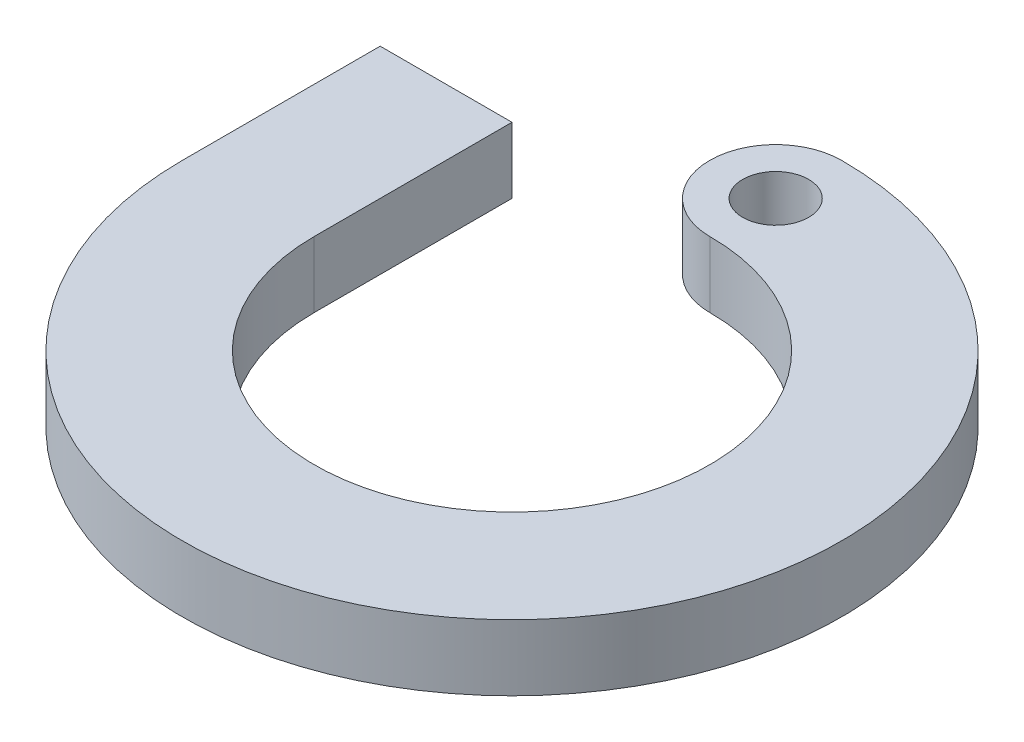
ISO-10303-21;
HEADER;
FILE_DESCRIPTION(('STEP AP214'),'2;1');
FILE_NAME('part.step','',(''),(''),'','','');
FILE_SCHEMA(('AUTOMOTIVE_DESIGN { 1 0 10303 214 1 1 1 1 }'));
ENDSEC;
DATA;
#1=APPLICATION_CONTEXT('core data for automotive mechanical design processes');
#2=APPLICATION_PROTOCOL_DEFINITION('international standard','automotive_design',2000,#1);
#3=PRODUCT_CONTEXT('',#1,'mechanical');
#4=PRODUCT('Part','Part','',(#3));
#5=PRODUCT_RELATED_PRODUCT_CATEGORY('part','',(#4));
#6=PRODUCT_DEFINITION_FORMATION('','',#4);
#7=PRODUCT_DEFINITION_CONTEXT('part definition',#1,'design');
#8=PRODUCT_DEFINITION('design','',#6,#7);
#9=PRODUCT_DEFINITION_SHAPE('','',#8);
#10=(LENGTH_UNIT() NAMED_UNIT(*) SI_UNIT(.MILLI.,.METRE.));
#11=(NAMED_UNIT(*) PLANE_ANGLE_UNIT() SI_UNIT($,.RADIAN.));
#12=(NAMED_UNIT(*) SI_UNIT($,.STERADIAN.) SOLID_ANGLE_UNIT());
#13=UNCERTAINTY_MEASURE_WITH_UNIT(LENGTH_MEASURE(1.E-05),#10,'distance_accuracy_value','');
#14=(GEOMETRIC_REPRESENTATION_CONTEXT(3) GLOBAL_UNCERTAINTY_ASSIGNED_CONTEXT((#13)) GLOBAL_UNIT_ASSIGNED_CONTEXT((#10,
#11,#12)) REPRESENTATION_CONTEXT('',''));
#15=CARTESIAN_POINT('',(0.,0.,0.));
#16=DIRECTION('',(0.,0.,1.));
#17=DIRECTION('',(1.,0.,0.));
#18=AXIS2_PLACEMENT_3D('',#15,#16,#17);
#19=CARTESIAN_POINT('',(0.,10.,0.));
#20=DIRECTION('',(0.,1.,0.));
#21=DIRECTION('',(0.,0.,1.));
#22=AXIS2_PLACEMENT_3D('',#19,#20,#21);
#23=PLANE('',#22);
#24=DIRECTION('',(0.,0.,-1.));
#25=VECTOR('',#24,1.);
#26=CARTESIAN_POINT('',(-30.,10.,0.));
#27=LINE('',#26,#25);
#28=CARTESIAN_POINT('',(-30.,10.,0.));
#29=VERTEX_POINT('',#28);
#30=CARTESIAN_POINT('',(-30.,10.,-30.));
#31=VERTEX_POINT('',#30);
#32=EDGE_CURVE('E152',#29,#31,#27,.T.);
#33=ORIENTED_EDGE('',*,*,#32,.T.);
#34=DIRECTION('',(-1.,0.,0.));
#35=VECTOR('',#34,1.);
#36=CARTESIAN_POINT('',(-50.,10.,-30.));
#37=LINE('',#36,#35);
#38=CARTESIAN_POINT('',(-50.,10.,-30.));
#39=VERTEX_POINT('',#38);
#40=EDGE_CURVE('E100',#31,#39,#37,.T.);
#41=ORIENTED_EDGE('',*,*,#40,.T.);
#42=DIRECTION('',(0.,0.,1.));
#43=VECTOR('',#42,1.);
#44=CARTESIAN_POINT('',(-50.,10.,0.));
#45=LINE('',#44,#43);
#46=CARTESIAN_POINT('',(-50.,10.,0.));
#47=VERTEX_POINT('',#46);
#48=EDGE_CURVE('E113',#39,#47,#45,.T.);
#49=ORIENTED_EDGE('',*,*,#48,.T.);
#50=CARTESIAN_POINT('',(0.,10.,0.));
#51=DIRECTION('',(0.,1.,0.));
#52=DIRECTION('',(0.,0.,1.));
#53=AXIS2_PLACEMENT_3D('',#50,#51,#52);
#54=CIRCLE('',#53,50.);
#55=CARTESIAN_POINT('',(0.,10.,-50.));
#56=VERTEX_POINT('',#55);
#57=EDGE_CURVE('E107',#47,#56,#54,.T.);
#58=ORIENTED_EDGE('',*,*,#57,.T.);
#59=CARTESIAN_POINT('',(0.,10.,-40.));
#60=DIRECTION('',(0.,1.,0.));
#61=DIRECTION('',(0.,0.,1.));
#62=AXIS2_PLACEMENT_3D('',#59,#60,#61);
#63=CIRCLE('',#62,10.);
#64=CARTESIAN_POINT('',(0.,10.,-30.));
#65=VERTEX_POINT('',#64);
#66=EDGE_CURVE('E111',#56,#65,#63,.T.);
#67=ORIENTED_EDGE('',*,*,#66,.T.);
#68=CARTESIAN_POINT('',(0.,10.,0.));
#69=DIRECTION('',(0.,-1.,0.));
#70=DIRECTION('',(0.,0.,1.));
#71=AXIS2_PLACEMENT_3D('',#68,#69,#70);
#72=CIRCLE('',#71,30.);
#73=EDGE_CURVE('E63',#65,#29,#72,.T.);
#74=ORIENTED_EDGE('',*,*,#73,.T.);
#75=EDGE_LOOP('',(#33,#41,#49,#58,#67,#74));
#76=FACE_BOUND('',#75,.T.);
#77=CARTESIAN_POINT('',(0.,10.,-40.));
#78=DIRECTION('',(0.,1.,0.));
#79=DIRECTION('',(0.,0.,1.));
#80=AXIS2_PLACEMENT_3D('',#77,#78,#79);
#81=CIRCLE('',#80,5.);
#82=CARTESIAN_POINT('',(0.,10.,-35.));
#83=VERTEX_POINT('',#82);
#84=EDGE_CURVE('E140',#83,#83,#81,.T.);
#85=ORIENTED_EDGE('',*,*,#84,.F.);
#86=EDGE_LOOP('',(#85));
#87=FACE_BOUND('',#86,.T.);
#88=ADVANCED_FACE('F45',(#76,#87),#23,.T.);
#89=CARTESIAN_POINT('',(0.,0.,0.));
#90=DIRECTION('',(0.,1.,0.));
#91=DIRECTION('',(0.,0.,1.));
#92=AXIS2_PLACEMENT_3D('',#89,#90,#91);
#93=PLANE('',#92);
#94=DIRECTION('',(0.,0.,-1.));
#95=VECTOR('',#94,1.);
#96=CARTESIAN_POINT('',(-30.,0.,0.));
#97=LINE('',#96,#95);
#98=CARTESIAN_POINT('',(-30.,0.,0.));
#99=VERTEX_POINT('',#98);
#100=CARTESIAN_POINT('',(-30.,0.,-30.));
#101=VERTEX_POINT('',#100);
#102=EDGE_CURVE('E135',#99,#101,#97,.T.);
#103=ORIENTED_EDGE('',*,*,#102,.F.);
#104=CARTESIAN_POINT('',(0.,0.,0.));
#105=DIRECTION('',(0.,-1.,0.));
#106=DIRECTION('',(0.,0.,1.));
#107=AXIS2_PLACEMENT_3D('',#104,#105,#106);
#108=CIRCLE('',#107,30.);
#109=CARTESIAN_POINT('',(0.,0.,-30.));
#110=VERTEX_POINT('',#109);
#111=EDGE_CURVE('E92',#110,#99,#108,.T.);
#112=ORIENTED_EDGE('',*,*,#111,.F.);
#113=CARTESIAN_POINT('',(0.,0.,-40.));
#114=DIRECTION('',(0.,1.,0.));
#115=DIRECTION('',(0.,0.,1.));
#116=AXIS2_PLACEMENT_3D('',#113,#114,#115);
#117=CIRCLE('',#116,10.);
#118=CARTESIAN_POINT('',(0.,0.,-50.));
#119=VERTEX_POINT('',#118);
#120=EDGE_CURVE('E86',#119,#110,#117,.T.);
#121=ORIENTED_EDGE('',*,*,#120,.F.);
#122=CARTESIAN_POINT('',(0.,0.,0.));
#123=DIRECTION('',(0.,1.,0.));
#124=DIRECTION('',(0.,0.,1.));
#125=AXIS2_PLACEMENT_3D('',#122,#123,#124);
#126=CIRCLE('',#125,50.);
#127=CARTESIAN_POINT('',(-50.,0.,0.));
#128=VERTEX_POINT('',#127);
#129=EDGE_CURVE('E122',#128,#119,#126,.T.);
#130=ORIENTED_EDGE('',*,*,#129,.F.);
#131=DIRECTION('',(0.,0.,1.));
#132=VECTOR('',#131,1.);
#133=CARTESIAN_POINT('',(-50.,0.,0.));
#134=LINE('',#133,#132);
#135=CARTESIAN_POINT('',(-50.,0.,-30.));
#136=VERTEX_POINT('',#135);
#137=EDGE_CURVE('E143',#136,#128,#134,.T.);
#138=ORIENTED_EDGE('',*,*,#137,.F.);
#139=DIRECTION('',(-1.,0.,0.));
#140=VECTOR('',#139,1.);
#141=CARTESIAN_POINT('',(-50.,0.,-30.));
#142=LINE('',#141,#140);
#143=EDGE_CURVE('E139',#101,#136,#142,.T.);
#144=ORIENTED_EDGE('',*,*,#143,.F.);
#145=EDGE_LOOP('',(#103,#112,#121,#130,#138,#144));
#146=FACE_BOUND('',#145,.T.);
#147=CARTESIAN_POINT('',(0.,0.,-40.));
#148=DIRECTION('',(0.,1.,0.));
#149=DIRECTION('',(0.,0.,1.));
#150=AXIS2_PLACEMENT_3D('',#147,#148,#149);
#151=CIRCLE('',#150,5.);
#152=CARTESIAN_POINT('',(0.,0.,-35.));
#153=VERTEX_POINT('',#152);
#154=EDGE_CURVE('E249',#153,#153,#151,.T.);
#155=ORIENTED_EDGE('',*,*,#154,.T.);
#156=EDGE_LOOP('',(#155));
#157=FACE_BOUND('',#156,.T.);
#158=ADVANCED_FACE('F165',(#146,#157),#93,.F.);
#159=CARTESIAN_POINT('',(-30.,10.,0.));
#160=DIRECTION('',(-1.,0.,0.));
#161=DIRECTION('',(0.,0.,1.));
#162=AXIS2_PLACEMENT_3D('',#159,#160,#161);
#163=PLANE('',#162);
#164=ORIENTED_EDGE('',*,*,#102,.T.);
#165=DIRECTION('',(0.,-1.,0.));
#166=VECTOR('',#165,1.);
#167=CARTESIAN_POINT('',(-30.,10.,-30.));
#168=LINE('',#167,#166);
#169=EDGE_CURVE('E11',#31,#101,#168,.T.);
#170=ORIENTED_EDGE('',*,*,#169,.F.);
#171=ORIENTED_EDGE('',*,*,#32,.F.);
#172=DIRECTION('',(0.,-1.,0.));
#173=VECTOR('',#172,1.);
#174=CARTESIAN_POINT('',(-30.,10.,0.));
#175=LINE('',#174,#173);
#176=EDGE_CURVE('E131',#29,#99,#175,.T.);
#177=ORIENTED_EDGE('',*,*,#176,.T.);
#178=EDGE_LOOP('',(#164,#170,#171,#177));
#179=FACE_BOUND('',#178,.T.);
#180=ADVANCED_FACE('F47',(#179),#163,.F.);
#181=CARTESIAN_POINT('',(-50.,10.,-30.));
#182=DIRECTION('',(0.,0.,1.));
#183=DIRECTION('',(1.,0.,0.));
#184=AXIS2_PLACEMENT_3D('',#181,#182,#183);
#185=PLANE('',#184);
#186=ORIENTED_EDGE('',*,*,#143,.T.);
#187=DIRECTION('',(0.,-1.,0.));
#188=VECTOR('',#187,1.);
#189=CARTESIAN_POINT('',(-50.,10.,-30.));
#190=LINE('',#189,#188);
#191=EDGE_CURVE('E55',#39,#136,#190,.T.);
#192=ORIENTED_EDGE('',*,*,#191,.F.);
#193=ORIENTED_EDGE('',*,*,#40,.F.);
#194=ORIENTED_EDGE('',*,*,#169,.T.);
#195=EDGE_LOOP('',(#186,#192,#193,#194));
#196=FACE_BOUND('',#195,.T.);
#197=ADVANCED_FACE('F190',(#196),#185,.F.);
#198=CARTESIAN_POINT('',(-50.,10.,0.));
#199=DIRECTION('',(1.,0.,0.));
#200=DIRECTION('',(0.,0.,-1.));
#201=AXIS2_PLACEMENT_3D('',#198,#199,#200);
#202=PLANE('',#201);
#203=ORIENTED_EDGE('',*,*,#137,.T.);
#204=DIRECTION('',(0.,-1.,0.));
#205=VECTOR('',#204,1.);
#206=CARTESIAN_POINT('',(-50.,10.,0.));
#207=LINE('',#206,#205);
#208=EDGE_CURVE('E124',#47,#128,#207,.T.);
#209=ORIENTED_EDGE('',*,*,#208,.F.);
#210=ORIENTED_EDGE('',*,*,#48,.F.);
#211=ORIENTED_EDGE('',*,*,#191,.T.);
#212=EDGE_LOOP('',(#203,#209,#210,#211));
#213=FACE_BOUND('',#212,.T.);
#214=ADVANCED_FACE('F162',(#213),#202,.F.);
#215=CARTESIAN_POINT('',(0.,10.,0.));
#216=DIRECTION('',(0.,-1.,0.));
#217=DIRECTION('',(0.,0.,-1.));
#218=AXIS2_PLACEMENT_3D('',#215,#216,#217);
#219=CYLINDRICAL_SURFACE('',#218,50.);
#220=ORIENTED_EDGE('',*,*,#129,.T.);
#221=DIRECTION('',(0.,-1.,0.));
#222=VECTOR('',#221,1.);
#223=CARTESIAN_POINT('',(0.,10.,-50.));
#224=LINE('',#223,#222);
#225=EDGE_CURVE('E119',#56,#119,#224,.T.);
#226=ORIENTED_EDGE('',*,*,#225,.F.);
#227=ORIENTED_EDGE('',*,*,#57,.F.);
#228=ORIENTED_EDGE('',*,*,#208,.T.);
#229=EDGE_LOOP('',(#220,#226,#227,#228));
#230=FACE_BOUND('',#229,.T.);
#231=ADVANCED_FACE('F120',(#230),#219,.T.);
#232=CARTESIAN_POINT('',(0.,10.,-40.));
#233=DIRECTION('',(0.,-1.,0.));
#234=DIRECTION('',(0.,0.,-1.));
#235=AXIS2_PLACEMENT_3D('',#232,#233,#234);
#236=CYLINDRICAL_SURFACE('',#235,10.);
#237=ORIENTED_EDGE('',*,*,#120,.T.);
#238=DIRECTION('',(0.,-1.,0.));
#239=VECTOR('',#238,1.);
#240=CARTESIAN_POINT('',(0.,10.,-30.));
#241=LINE('',#240,#239);
#242=EDGE_CURVE('E125',#65,#110,#241,.T.);
#243=ORIENTED_EDGE('',*,*,#242,.F.);
#244=ORIENTED_EDGE('',*,*,#66,.F.);
#245=ORIENTED_EDGE('',*,*,#225,.T.);
#246=EDGE_LOOP('',(#237,#243,#244,#245));
#247=FACE_BOUND('',#246,.T.);
#248=ADVANCED_FACE('F127',(#247),#236,.T.);
#249=CARTESIAN_POINT('',(0.,10.,0.));
#250=DIRECTION('',(0.,-1.,0.));
#251=DIRECTION('',(0.,0.,-1.));
#252=AXIS2_PLACEMENT_3D('',#249,#250,#251);
#253=CYLINDRICAL_SURFACE('',#252,30.);
#254=ORIENTED_EDGE('',*,*,#111,.T.);
#255=ORIENTED_EDGE('',*,*,#176,.F.);
#256=ORIENTED_EDGE('',*,*,#73,.F.);
#257=ORIENTED_EDGE('',*,*,#242,.T.);
#258=EDGE_LOOP('',(#254,#255,#256,#257));
#259=FACE_BOUND('',#258,.T.);
#260=ADVANCED_FACE('F170',(#259),#253,.F.);
#261=CARTESIAN_POINT('',(0.,10.,-40.));
#262=DIRECTION('',(0.,-1.,0.));
#263=DIRECTION('',(0.,0.,-1.));
#264=AXIS2_PLACEMENT_3D('',#261,#262,#263);
#265=CYLINDRICAL_SURFACE('',#264,5.);
#266=ORIENTED_EDGE('',*,*,#84,.T.);
#267=EDGE_LOOP('',(#266));
#268=FACE_BOUND('',#267,.T.);
#269=ORIENTED_EDGE('',*,*,#154,.F.);
#270=EDGE_LOOP('',(#269));
#271=FACE_BOUND('',#270,.T.);
#272=ADVANCED_FACE('F172',(#268,#271),#265,.F.);
#273=CLOSED_SHELL('',(#88,#158,#180,#197,#214,#231,#248,#260,#272));
#274=MANIFOLD_SOLID_BREP('B2',#273);
#275=ADVANCED_BREP_SHAPE_REPRESENTATION('',(#18,#274),#14);
#276=SHAPE_DEFINITION_REPRESENTATION(#9,#275);
ENDSEC;
END-ISO-10303-21;
